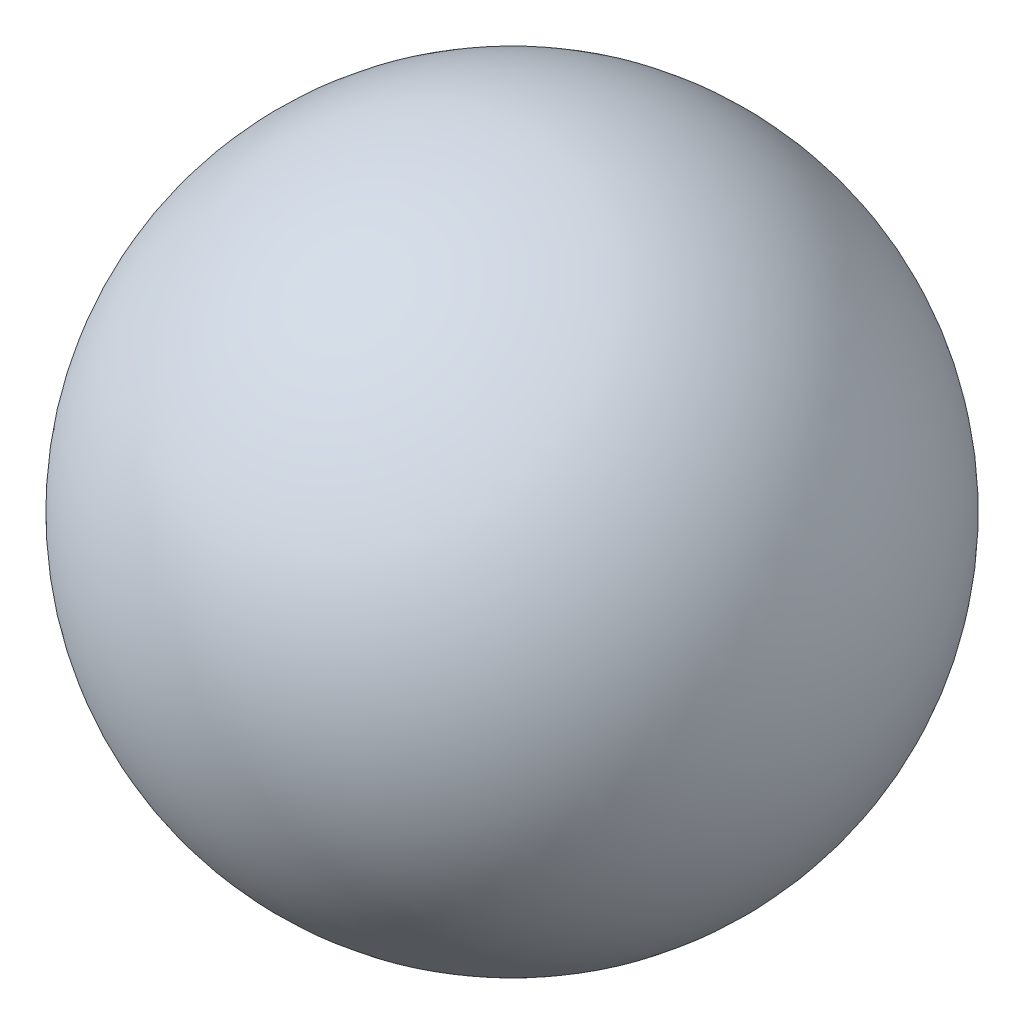
ISO-10303-21;
HEADER;
FILE_DESCRIPTION(('STEP AP214'),'2;1');
FILE_NAME('part.step','',(''),(''),'','','');
FILE_SCHEMA(('AUTOMOTIVE_DESIGN { 1 0 10303 214 1 1 1 1 }'));
ENDSEC;
DATA;
#1=APPLICATION_CONTEXT('core data for automotive mechanical design processes');
#2=APPLICATION_PROTOCOL_DEFINITION('international standard','automotive_design',2000,#1);
#3=PRODUCT_CONTEXT('',#1,'mechanical');
#4=PRODUCT('Part','Part','',(#3));
#5=PRODUCT_RELATED_PRODUCT_CATEGORY('part','',(#4));
#6=PRODUCT_DEFINITION_FORMATION('','',#4);
#7=PRODUCT_DEFINITION_CONTEXT('part definition',#1,'design');
#8=PRODUCT_DEFINITION('design','',#6,#7);
#9=PRODUCT_DEFINITION_SHAPE('','',#8);
#10=(LENGTH_UNIT() NAMED_UNIT(*) SI_UNIT(.MILLI.,.METRE.));
#11=(NAMED_UNIT(*) PLANE_ANGLE_UNIT() SI_UNIT($,.RADIAN.));
#12=(NAMED_UNIT(*) SI_UNIT($,.STERADIAN.) SOLID_ANGLE_UNIT());
#13=UNCERTAINTY_MEASURE_WITH_UNIT(LENGTH_MEASURE(1.E-05),#10,'distance_accuracy_value','');
#14=(GEOMETRIC_REPRESENTATION_CONTEXT(3) GLOBAL_UNCERTAINTY_ASSIGNED_CONTEXT((#13)) GLOBAL_UNIT_ASSIGNED_CONTEXT((#10,
#11,#12)) REPRESENTATION_CONTEXT('',''));
#15=CARTESIAN_POINT('',(0.,0.,0.));
#16=DIRECTION('',(0.,0.,1.));
#17=DIRECTION('',(1.,0.,0.));
#18=AXIS2_PLACEMENT_3D('',#15,#16,#17);
#19=CARTESIAN_POINT('',(0.,0.,0.));
#20=DIRECTION('',(0.,1.,0.));
#21=DIRECTION('',(1.,0.,0.));
#22=AXIS2_PLACEMENT_3D('',#19,#20,#21);
#23=SPHERICAL_SURFACE('',#22,1.25);
#24=CARTESIAN_POINT('',(0.,1.25,0.));
#25=VERTEX_POINT('',#24);
#26=VERTEX_LOOP('',#25);
#27=FACE_BOUND('',#26,.T.);
#28=ADVANCED_FACE('F40',(#27),#23,.T.);
#29=CLOSED_SHELL('',(#28));
#30=MANIFOLD_SOLID_BREP('B2',#29);
#31=ADVANCED_BREP_SHAPE_REPRESENTATION('',(#18,#30),#14);
#32=SHAPE_DEFINITION_REPRESENTATION(#9,#31);
ENDSEC;
END-ISO-10303-21;
